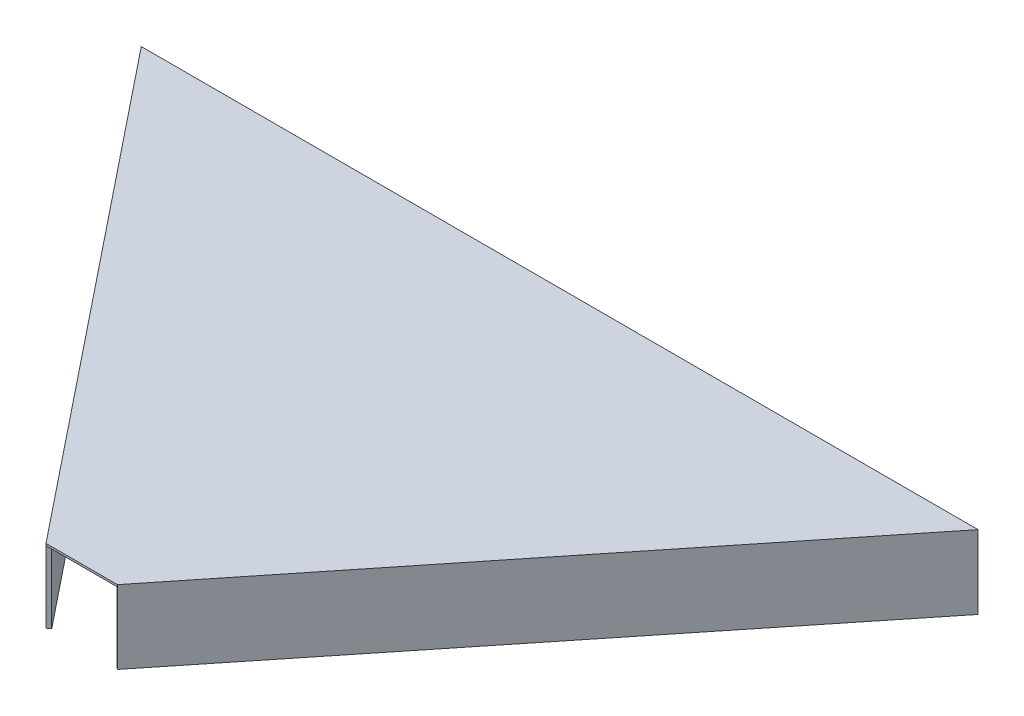
ISO-10303-21;
HEADER;
FILE_DESCRIPTION(('STEP AP214'),'2;1');
FILE_NAME('part.step','',(''),(''),'','','');
FILE_SCHEMA(('AUTOMOTIVE_DESIGN { 1 0 10303 214 1 1 1 1 }'));
ENDSEC;
DATA;
#1=APPLICATION_CONTEXT('core data for automotive mechanical design processes');
#2=APPLICATION_PROTOCOL_DEFINITION('international standard','automotive_design',2000,#1);
#3=PRODUCT_CONTEXT('',#1,'mechanical');
#4=PRODUCT('Part','Part','',(#3));
#5=PRODUCT_RELATED_PRODUCT_CATEGORY('part','',(#4));
#6=PRODUCT_DEFINITION_FORMATION('','',#4);
#7=PRODUCT_DEFINITION_CONTEXT('part definition',#1,'design');
#8=PRODUCT_DEFINITION('design','',#6,#7);
#9=PRODUCT_DEFINITION_SHAPE('','',#8);
#10=(LENGTH_UNIT() NAMED_UNIT(*) SI_UNIT(.MILLI.,.METRE.));
#11=(NAMED_UNIT(*) PLANE_ANGLE_UNIT() SI_UNIT($,.RADIAN.));
#12=(NAMED_UNIT(*) SI_UNIT($,.STERADIAN.) SOLID_ANGLE_UNIT());
#13=UNCERTAINTY_MEASURE_WITH_UNIT(LENGTH_MEASURE(1.E-05),#10,'distance_accuracy_value','');
#14=(GEOMETRIC_REPRESENTATION_CONTEXT(3) GLOBAL_UNCERTAINTY_ASSIGNED_CONTEXT((#13)) GLOBAL_UNIT_ASSIGNED_CONTEXT((#10,
#11,#12)) REPRESENTATION_CONTEXT('',''));
#15=CARTESIAN_POINT('',(0.,0.,0.));
#16=DIRECTION('',(0.,0.,1.));
#17=DIRECTION('',(1.,0.,0.));
#18=AXIS2_PLACEMENT_3D('',#15,#16,#17);
#19=CARTESIAN_POINT('',(0.,35.,0.));
#20=DIRECTION('',(0.,1.,0.));
#21=DIRECTION('',(0.,0.,1.));
#22=AXIS2_PLACEMENT_3D('',#19,#20,#21);
#23=PLANE('',#22);
#24=DIRECTION('',(0.780624749799799,0.,-0.625000000000001));
#25=VECTOR('',#24,1.);
#26=CARTESIAN_POINT('',(-17.5,35.,234.18742493994));
#27=LINE('',#26,#25);
#28=CARTESIAN_POINT('',(-17.5,35.,234.18742493994));
#29=VERTEX_POINT('',#28);
#30=CARTESIAN_POINT('',(-15.9387505004004,35.,232.93742493994));
#31=VERTEX_POINT('',#30);
#32=EDGE_CURVE('E161',#29,#31,#27,.T.);
#33=ORIENTED_EDGE('',*,*,#32,.T.);
#34=DIRECTION('',(-0.625,0.,-0.7806247497998));
#35=VECTOR('',#34,1.);
#36=CARTESIAN_POINT('',(-200.836668001068,35.,2.));
#37=LINE('',#36,#35);
#38=CARTESIAN_POINT('',(-200.836668001068,35.,2.));
#39=VERTEX_POINT('',#38);
#40=EDGE_CURVE('E146',#31,#39,#37,.T.);
#41=ORIENTED_EDGE('',*,*,#40,.T.);
#42=DIRECTION('',(0.,0.,1.));
#43=VECTOR('',#42,1.);
#44=CARTESIAN_POINT('',(-200.836668001068,35.,0.));
#45=LINE('',#44,#43);
#46=CARTESIAN_POINT('',(-200.836668001068,35.,0.));
#47=VERTEX_POINT('',#46);
#48=EDGE_CURVE('E129',#47,#39,#45,.T.);
#49=ORIENTED_EDGE('',*,*,#48,.F.);
#50=DIRECTION('',(-1.,0.,0.));
#51=VECTOR('',#50,1.);
#52=CARTESIAN_POINT('',(205.,35.,0.));
#53=LINE('',#52,#51);
#54=CARTESIAN_POINT('',(200.836253908276,35.,0.));
#55=VERTEX_POINT('',#54);
#56=EDGE_CURVE('E165',#55,#47,#53,.T.);
#57=ORIENTED_EDGE('',*,*,#56,.F.);
#58=DIRECTION('',(0.,0.,-1.));
#59=VECTOR('',#58,1.);
#60=CARTESIAN_POINT('',(200.836253908276,35.,0.));
#61=LINE('',#60,#59);
#62=CARTESIAN_POINT('',(200.836253908276,35.,2.));
#63=VERTEX_POINT('',#62);
#64=EDGE_CURVE('E195',#63,#55,#61,.T.);
#65=ORIENTED_EDGE('',*,*,#64,.F.);
#66=DIRECTION('',(1.,0.,0.));
#67=VECTOR('',#66,1.);
#68=CARTESIAN_POINT('',(-200.836668001068,35.,2.));
#69=LINE('',#68,#67);
#70=CARTESIAN_POINT('',(200.836668001068,35.,2.));
#71=VERTEX_POINT('',#70);
#72=EDGE_CURVE('E200',#63,#71,#69,.T.);
#73=ORIENTED_EDGE('',*,*,#72,.T.);
#74=DIRECTION('',(-0.625,0.,0.7806247497998));
#75=VECTOR('',#74,1.);
#76=CARTESIAN_POINT('',(200.836668001068,35.,2.));
#77=LINE('',#76,#75);
#78=CARTESIAN_POINT('',(15.9387505004004,35.,232.93742493994));
#79=VERTEX_POINT('',#78);
#80=EDGE_CURVE('E202',#71,#79,#77,.T.);
#81=ORIENTED_EDGE('',*,*,#80,.T.);
#82=DIRECTION('',(0.780624749799825,0.,0.624999999999968));
#83=VECTOR('',#82,1.);
#84=CARTESIAN_POINT('',(15.9387505004004,35.,232.93742493994));
#85=LINE('',#84,#83);
#86=CARTESIAN_POINT('',(17.5,35.,234.18742493994));
#87=VERTEX_POINT('',#86);
#88=EDGE_CURVE('E204',#79,#87,#85,.T.);
#89=ORIENTED_EDGE('',*,*,#88,.T.);
#90=DIRECTION('',(1.,0.,0.));
#91=VECTOR('',#90,1.);
#92=CARTESIAN_POINT('',(-17.5,35.,234.18742493994));
#93=LINE('',#92,#91);
#94=EDGE_CURVE('E172',#29,#87,#93,.T.);
#95=ORIENTED_EDGE('',*,*,#94,.F.);
#96=EDGE_LOOP('',(#33,#41,#49,#57,#65,#73,#81,#89,#95));
#97=FACE_BOUND('',#96,.T.);
#98=ADVANCED_FACE('F32',(#97),#23,.F.);
#99=CARTESIAN_POINT('',(200.836668001068,35.,2.));
#100=DIRECTION('',(0.7806247497998,0.,0.625));
#101=DIRECTION('',(0.625,0.,-0.7806247497998));
#102=AXIS2_PLACEMENT_3D('',#99,#100,#101);
#103=PLANE('',#102);
#104=DIRECTION('',(-0.625,0.,0.7806247497998));
#105=VECTOR('',#104,1.);
#106=CARTESIAN_POINT('',(200.836668001068,0.,2.));
#107=LINE('',#106,#105);
#108=CARTESIAN_POINT('',(200.836668001068,0.,2.));
#109=VERTEX_POINT('',#108);
#110=CARTESIAN_POINT('',(15.9387505004004,0.,232.93742493994));
#111=VERTEX_POINT('',#110);
#112=EDGE_CURVE('E214',#109,#111,#107,.T.);
#113=ORIENTED_EDGE('',*,*,#112,.T.);
#114=DIRECTION('',(0.,-1.,0.));
#115=VECTOR('',#114,1.);
#116=CARTESIAN_POINT('',(15.9387505004004,35.,232.93742493994));
#117=LINE('',#116,#115);
#118=EDGE_CURVE('E218',#79,#111,#117,.T.);
#119=ORIENTED_EDGE('',*,*,#118,.F.);
#120=ORIENTED_EDGE('',*,*,#80,.F.);
#121=DIRECTION('',(0.,-1.,0.));
#122=VECTOR('',#121,1.);
#123=CARTESIAN_POINT('',(200.836668001068,35.,2.));
#124=LINE('',#123,#122);
#125=EDGE_CURVE('E40',#71,#109,#124,.T.);
#126=ORIENTED_EDGE('',*,*,#125,.T.);
#127=EDGE_LOOP('',(#113,#119,#120,#126));
#128=FACE_BOUND('',#127,.T.);
#129=ADVANCED_FACE('F224',(#128),#103,.F.);
#130=CARTESIAN_POINT('',(15.9387505004004,35.,232.93742493994));
#131=DIRECTION('',(0.624999999999968,0.,-0.780624749799825));
#132=DIRECTION('',(-0.780624749799825,0.,-0.624999999999968));
#133=AXIS2_PLACEMENT_3D('',#130,#131,#132);
#134=PLANE('',#133);
#135=DIRECTION('',(0.780624749799825,0.,0.624999999999968));
#136=VECTOR('',#135,1.);
#137=CARTESIAN_POINT('',(15.9387505004004,0.,232.93742493994));
#138=LINE('',#137,#136);
#139=CARTESIAN_POINT('',(17.5,0.,234.18742493994));
#140=VERTEX_POINT('',#139);
#141=EDGE_CURVE('E55',#111,#140,#138,.T.);
#142=ORIENTED_EDGE('',*,*,#141,.T.);
#143=DIRECTION('',(0.,-1.,0.));
#144=VECTOR('',#143,1.);
#145=CARTESIAN_POINT('',(17.5,35.,234.18742493994));
#146=LINE('',#145,#144);
#147=EDGE_CURVE('E206',#87,#140,#146,.T.);
#148=ORIENTED_EDGE('',*,*,#147,.F.);
#149=ORIENTED_EDGE('',*,*,#88,.F.);
#150=ORIENTED_EDGE('',*,*,#118,.T.);
#151=EDGE_LOOP('',(#142,#148,#149,#150));
#152=FACE_BOUND('',#151,.T.);
#153=ADVANCED_FACE('F236',(#152),#134,.F.);
#154=CARTESIAN_POINT('',(205.,35.,0.));
#155=DIRECTION('',(-0.7806247497998,0.,-0.625));
#156=DIRECTION('',(-0.625,0.,0.7806247497998));
#157=AXIS2_PLACEMENT_3D('',#154,#155,#156);
#158=PLANE('',#157);
#159=DIRECTION('',(0.625,0.,-0.7806247497998));
#160=VECTOR('',#159,1.);
#161=CARTESIAN_POINT('',(205.,0.,0.));
#162=LINE('',#161,#160);
#163=CARTESIAN_POINT('',(205.,0.,0.));
#164=VERTEX_POINT('',#163);
#165=EDGE_CURVE('E199',#140,#164,#162,.T.);
#166=ORIENTED_EDGE('',*,*,#165,.T.);
#167=DIRECTION('',(0.,-1.,0.));
#168=VECTOR('',#167,1.);
#169=CARTESIAN_POINT('',(205.,35.,0.));
#170=LINE('',#169,#168);
#171=CARTESIAN_POINT('',(205.,36.,0.));
#172=VERTEX_POINT('',#171);
#173=EDGE_CURVE('E11',#172,#164,#170,.T.);
#174=ORIENTED_EDGE('',*,*,#173,.F.);
#175=DIRECTION('',(0.625,0.,-0.7806247497998));
#176=VECTOR('',#175,1.);
#177=CARTESIAN_POINT('',(17.5,36.,234.18742493994));
#178=LINE('',#177,#176);
#179=CARTESIAN_POINT('',(17.5,36.,234.18742493994));
#180=VERTEX_POINT('',#179);
#181=EDGE_CURVE('E176',#180,#172,#178,.T.);
#182=ORIENTED_EDGE('',*,*,#181,.F.);
#183=DIRECTION('',(0.,-1.,0.));
#184=VECTOR('',#183,1.);
#185=CARTESIAN_POINT('',(17.5,36.,234.18742493994));
#186=LINE('',#185,#184);
#187=EDGE_CURVE('E179',#180,#87,#186,.T.);
#188=ORIENTED_EDGE('',*,*,#187,.T.);
#189=ORIENTED_EDGE('',*,*,#147,.T.);
#190=EDGE_LOOP('',(#166,#174,#182,#188,#189));
#191=FACE_BOUND('',#190,.T.);
#192=ADVANCED_FACE('F34',(#191),#158,.F.);
#193=CARTESIAN_POINT('',(0.,0.,0.));
#194=DIRECTION('',(0.,1.,0.));
#195=DIRECTION('',(0.,0.,1.));
#196=AXIS2_PLACEMENT_3D('',#193,#194,#195);
#197=PLANE('',#196);
#198=DIRECTION('',(1.,0.,0.));
#199=VECTOR('',#198,1.);
#200=CARTESIAN_POINT('',(-200.836668001068,0.,2.));
#201=LINE('',#200,#199);
#202=CARTESIAN_POINT('',(200.836253908276,0.,2.));
#203=VERTEX_POINT('',#202);
#204=EDGE_CURVE('E212',#203,#109,#201,.T.);
#205=ORIENTED_EDGE('',*,*,#204,.F.);
#206=DIRECTION('',(0.,0.,-1.));
#207=VECTOR('',#206,1.);
#208=CARTESIAN_POINT('',(200.836253908276,0.,2.));
#209=LINE('',#208,#207);
#210=CARTESIAN_POINT('',(200.836253908276,0.,0.));
#211=VERTEX_POINT('',#210);
#212=EDGE_CURVE('E191',#203,#211,#209,.T.);
#213=ORIENTED_EDGE('',*,*,#212,.T.);
#214=DIRECTION('',(-1.,0.,0.));
#215=VECTOR('',#214,1.);
#216=CARTESIAN_POINT('',(-205.,0.,0.));
#217=LINE('',#216,#215);
#218=EDGE_CURVE('E209',#164,#211,#217,.T.);
#219=ORIENTED_EDGE('',*,*,#218,.F.);
#220=ORIENTED_EDGE('',*,*,#165,.F.);
#221=ORIENTED_EDGE('',*,*,#141,.F.);
#222=ORIENTED_EDGE('',*,*,#112,.F.);
#223=EDGE_LOOP('',(#205,#213,#219,#220,#221,#222));
#224=FACE_BOUND('',#223,.T.);
#225=ADVANCED_FACE('F230',(#224),#197,.F.);
#226=CARTESIAN_POINT('',(-200.836668001068,35.,2.));
#227=DIRECTION('',(0.,0.,-1.));
#228=DIRECTION('',(-1.,0.,0.));
#229=AXIS2_PLACEMENT_3D('',#226,#227,#228);
#230=PLANE('',#229);
#231=ORIENTED_EDGE('',*,*,#72,.F.);
#232=DIRECTION('',(0.,1.,0.));
#233=VECTOR('',#232,1.);
#234=CARTESIAN_POINT('',(200.836253908276,0.,2.));
#235=LINE('',#234,#233);
#236=EDGE_CURVE('E193',#203,#63,#235,.T.);
#237=ORIENTED_EDGE('',*,*,#236,.F.);
#238=ORIENTED_EDGE('',*,*,#204,.T.);
#239=ORIENTED_EDGE('',*,*,#125,.F.);
#240=EDGE_LOOP('',(#231,#237,#238,#239));
#241=FACE_BOUND('',#240,.T.);
#242=ADVANCED_FACE('F276',(#241),#230,.F.);
#243=CARTESIAN_POINT('',(-205.,35.,0.));
#244=DIRECTION('',(0.,0.,1.));
#245=DIRECTION('',(1.,0.,0.));
#246=AXIS2_PLACEMENT_3D('',#243,#244,#245);
#247=PLANE('',#246);
#248=ORIENTED_EDGE('',*,*,#218,.T.);
#249=DIRECTION('',(0.,1.,0.));
#250=VECTOR('',#249,1.);
#251=CARTESIAN_POINT('',(200.836253908276,0.,0.));
#252=LINE('',#251,#250);
#253=EDGE_CURVE('E47',#211,#55,#252,.T.);
#254=ORIENTED_EDGE('',*,*,#253,.T.);
#255=ORIENTED_EDGE('',*,*,#56,.T.);
#256=DIRECTION('',(0.,1.,0.));
#257=VECTOR('',#256,1.);
#258=CARTESIAN_POINT('',(-200.836668001068,0.,0.));
#259=LINE('',#258,#257);
#260=CARTESIAN_POINT('',(-200.836668001068,0.,0.));
#261=VERTEX_POINT('',#260);
#262=EDGE_CURVE('E134',#261,#47,#259,.T.);
#263=ORIENTED_EDGE('',*,*,#262,.F.);
#264=DIRECTION('',(-1.,0.,0.));
#265=VECTOR('',#264,1.);
#266=CARTESIAN_POINT('',(-205.,0.,0.));
#267=LINE('',#266,#265);
#268=CARTESIAN_POINT('',(-205.,0.,0.));
#269=VERTEX_POINT('',#268);
#270=EDGE_CURVE('E144',#261,#269,#267,.T.);
#271=ORIENTED_EDGE('',*,*,#270,.T.);
#272=DIRECTION('',(0.,-1.,0.));
#273=VECTOR('',#272,1.);
#274=CARTESIAN_POINT('',(-205.,36.,0.));
#275=LINE('',#274,#273);
#276=CARTESIAN_POINT('',(-205.,36.,0.));
#277=VERTEX_POINT('',#276);
#278=EDGE_CURVE('E189',#277,#269,#275,.T.);
#279=ORIENTED_EDGE('',*,*,#278,.F.);
#280=DIRECTION('',(-1.,0.,0.));
#281=VECTOR('',#280,1.);
#282=CARTESIAN_POINT('',(205.,36.,0.));
#283=LINE('',#282,#281);
#284=EDGE_CURVE('E168',#172,#277,#283,.T.);
#285=ORIENTED_EDGE('',*,*,#284,.F.);
#286=ORIENTED_EDGE('',*,*,#173,.T.);
#287=EDGE_LOOP('',(#248,#254,#255,#263,#271,#279,#285,#286));
#288=FACE_BOUND('',#287,.T.);
#289=ADVANCED_FACE('F249',(#288),#247,.F.);
#290=CARTESIAN_POINT('',(200.836253908276,0.,2.));
#291=DIRECTION('',(1.,0.,0.));
#292=DIRECTION('',(0.,0.,-1.));
#293=AXIS2_PLACEMENT_3D('',#290,#291,#292);
#294=PLANE('',#293);
#295=ORIENTED_EDGE('',*,*,#64,.T.);
#296=ORIENTED_EDGE('',*,*,#253,.F.);
#297=ORIENTED_EDGE('',*,*,#212,.F.);
#298=ORIENTED_EDGE('',*,*,#236,.T.);
#299=EDGE_LOOP('',(#295,#296,#297,#298));
#300=FACE_BOUND('',#299,.T.);
#301=ADVANCED_FACE('F271',(#300),#294,.F.);
#302=CARTESIAN_POINT('',(-205.,36.,0.));
#303=DIRECTION('',(0.7806247497998,0.,-0.625));
#304=DIRECTION('',(-0.625,0.,-0.7806247497998));
#305=AXIS2_PLACEMENT_3D('',#302,#303,#304);
#306=PLANE('',#305);
#307=ORIENTED_EDGE('',*,*,#278,.T.);
#308=DIRECTION('',(0.625,0.,0.7806247497998));
#309=VECTOR('',#308,1.);
#310=CARTESIAN_POINT('',(-205.,0.,0.));
#311=LINE('',#310,#309);
#312=CARTESIAN_POINT('',(-17.5,0.,234.18742493994));
#313=VERTEX_POINT('',#312);
#314=EDGE_CURVE('E145',#269,#313,#311,.T.);
#315=ORIENTED_EDGE('',*,*,#314,.T.);
#316=DIRECTION('',(0.,-1.,0.));
#317=VECTOR('',#316,1.);
#318=CARTESIAN_POINT('',(-17.5,35.,234.18742493994));
#319=LINE('',#318,#317);
#320=EDGE_CURVE('E151',#29,#313,#319,.T.);
#321=ORIENTED_EDGE('',*,*,#320,.F.);
#322=DIRECTION('',(0.,-1.,0.));
#323=VECTOR('',#322,1.);
#324=CARTESIAN_POINT('',(-17.5,36.,234.18742493994));
#325=LINE('',#324,#323);
#326=CARTESIAN_POINT('',(-17.5,36.,234.18742493994));
#327=VERTEX_POINT('',#326);
#328=EDGE_CURVE('E186',#327,#29,#325,.T.);
#329=ORIENTED_EDGE('',*,*,#328,.F.);
#330=DIRECTION('',(0.625,0.,0.7806247497998));
#331=VECTOR('',#330,1.);
#332=CARTESIAN_POINT('',(-205.,36.,0.));
#333=LINE('',#332,#331);
#334=EDGE_CURVE('E171',#277,#327,#333,.T.);
#335=ORIENTED_EDGE('',*,*,#334,.F.);
#336=EDGE_LOOP('',(#307,#315,#321,#329,#335));
#337=FACE_BOUND('',#336,.T.);
#338=ADVANCED_FACE('F245',(#337),#306,.F.);
#339=CARTESIAN_POINT('',(-17.5,36.,234.18742493994));
#340=DIRECTION('',(0.,0.,-1.));
#341=DIRECTION('',(-1.,0.,0.));
#342=AXIS2_PLACEMENT_3D('',#339,#340,#341);
#343=PLANE('',#342);
#344=ORIENTED_EDGE('',*,*,#94,.T.);
#345=ORIENTED_EDGE('',*,*,#187,.F.);
#346=DIRECTION('',(1.,0.,0.));
#347=VECTOR('',#346,1.);
#348=CARTESIAN_POINT('',(-17.5,36.,234.18742493994));
#349=LINE('',#348,#347);
#350=EDGE_CURVE('E174',#327,#180,#349,.T.);
#351=ORIENTED_EDGE('',*,*,#350,.F.);
#352=ORIENTED_EDGE('',*,*,#328,.T.);
#353=EDGE_LOOP('',(#344,#345,#351,#352));
#354=FACE_BOUND('',#353,.T.);
#355=ADVANCED_FACE('F240',(#354),#343,.F.);
#356=CARTESIAN_POINT('',(0.,36.,0.));
#357=DIRECTION('',(0.,1.,0.));
#358=DIRECTION('',(0.,0.,1.));
#359=AXIS2_PLACEMENT_3D('',#356,#357,#358);
#360=PLANE('',#359);
#361=ORIENTED_EDGE('',*,*,#284,.T.);
#362=ORIENTED_EDGE('',*,*,#334,.T.);
#363=ORIENTED_EDGE('',*,*,#350,.T.);
#364=ORIENTED_EDGE('',*,*,#181,.T.);
#365=EDGE_LOOP('',(#361,#362,#363,#364));
#366=FACE_BOUND('',#365,.T.);
#367=ADVANCED_FACE('F253',(#366),#360,.T.);
#368=CARTESIAN_POINT('',(0.,0.,0.));
#369=DIRECTION('',(0.,1.,0.));
#370=DIRECTION('',(0.,0.,1.));
#371=AXIS2_PLACEMENT_3D('',#368,#369,#370);
#372=PLANE('',#371);
#373=ORIENTED_EDGE('',*,*,#270,.F.);
#374=DIRECTION('',(0.,0.,1.));
#375=VECTOR('',#374,1.);
#376=CARTESIAN_POINT('',(-200.836668001068,0.,2.));
#377=LINE('',#376,#375);
#378=CARTESIAN_POINT('',(-200.836668001068,0.,2.));
#379=VERTEX_POINT('',#378);
#380=EDGE_CURVE('E126',#261,#379,#377,.T.);
#381=ORIENTED_EDGE('',*,*,#380,.T.);
#382=DIRECTION('',(-0.625,0.,-0.7806247497998));
#383=VECTOR('',#382,1.);
#384=CARTESIAN_POINT('',(-200.836668001068,0.,2.));
#385=LINE('',#384,#383);
#386=CARTESIAN_POINT('',(-15.9387505004004,0.,232.93742493994));
#387=VERTEX_POINT('',#386);
#388=EDGE_CURVE('E141',#387,#379,#385,.T.);
#389=ORIENTED_EDGE('',*,*,#388,.F.);
#390=DIRECTION('',(0.780624749799799,0.,-0.625000000000001));
#391=VECTOR('',#390,1.);
#392=CARTESIAN_POINT('',(-17.5,0.,234.18742493994));
#393=LINE('',#392,#391);
#394=EDGE_CURVE('E155',#313,#387,#393,.T.);
#395=ORIENTED_EDGE('',*,*,#394,.F.);
#396=ORIENTED_EDGE('',*,*,#314,.F.);
#397=EDGE_LOOP('',(#373,#381,#389,#395,#396));
#398=FACE_BOUND('',#397,.T.);
#399=ADVANCED_FACE('F139',(#398),#372,.F.);
#400=CARTESIAN_POINT('',(-17.5,35.,234.18742493994));
#401=DIRECTION('',(-0.625000000000001,0.,-0.780624749799799));
#402=DIRECTION('',(-0.780624749799799,0.,0.625000000000001));
#403=AXIS2_PLACEMENT_3D('',#400,#401,#402);
#404=PLANE('',#403);
#405=ORIENTED_EDGE('',*,*,#394,.T.);
#406=DIRECTION('',(0.,-1.,0.));
#407=VECTOR('',#406,1.);
#408=CARTESIAN_POINT('',(-15.9387505004004,35.,232.93742493994));
#409=LINE('',#408,#407);
#410=EDGE_CURVE('E150',#31,#387,#409,.T.);
#411=ORIENTED_EDGE('',*,*,#410,.F.);
#412=ORIENTED_EDGE('',*,*,#32,.F.);
#413=ORIENTED_EDGE('',*,*,#320,.T.);
#414=EDGE_LOOP('',(#405,#411,#412,#413));
#415=FACE_BOUND('',#414,.T.);
#416=ADVANCED_FACE('F247',(#415),#404,.F.);
#417=CARTESIAN_POINT('',(-200.836668001068,35.,2.));
#418=DIRECTION('',(-0.7806247497998,0.,0.625));
#419=DIRECTION('',(0.625,0.,0.7806247497998));
#420=AXIS2_PLACEMENT_3D('',#417,#418,#419);
#421=PLANE('',#420);
#422=ORIENTED_EDGE('',*,*,#388,.T.);
#423=DIRECTION('',(0.,-1.,0.));
#424=VECTOR('',#423,1.);
#425=CARTESIAN_POINT('',(-200.836668001068,35.,2.));
#426=LINE('',#425,#424);
#427=EDGE_CURVE('E123',#39,#379,#426,.T.);
#428=ORIENTED_EDGE('',*,*,#427,.F.);
#429=ORIENTED_EDGE('',*,*,#40,.F.);
#430=ORIENTED_EDGE('',*,*,#410,.T.);
#431=EDGE_LOOP('',(#422,#428,#429,#430));
#432=FACE_BOUND('',#431,.T.);
#433=ADVANCED_FACE('F149',(#432),#421,.F.);
#434=CARTESIAN_POINT('',(-200.836668001068,0.,2.));
#435=DIRECTION('',(-1.,0.,0.));
#436=DIRECTION('',(0.,0.,1.));
#437=AXIS2_PLACEMENT_3D('',#434,#435,#436);
#438=PLANE('',#437);
#439=ORIENTED_EDGE('',*,*,#48,.T.);
#440=ORIENTED_EDGE('',*,*,#427,.T.);
#441=ORIENTED_EDGE('',*,*,#380,.F.);
#442=ORIENTED_EDGE('',*,*,#262,.T.);
#443=EDGE_LOOP('',(#439,#440,#441,#442));
#444=FACE_BOUND('',#443,.T.);
#445=ADVANCED_FACE('F125',(#444),#438,.F.);
#446=CLOSED_SHELL('',(#98,#129,#153,#192,#225,#242,#289,#301,#338,#355,#367,#399,#416,#433,#445));
#447=MANIFOLD_SOLID_BREP('B2',#446);
#448=ADVANCED_BREP_SHAPE_REPRESENTATION('',(#18,#447),#14);
#449=SHAPE_DEFINITION_REPRESENTATION(#9,#448);
ENDSEC;
END-ISO-10303-21;
